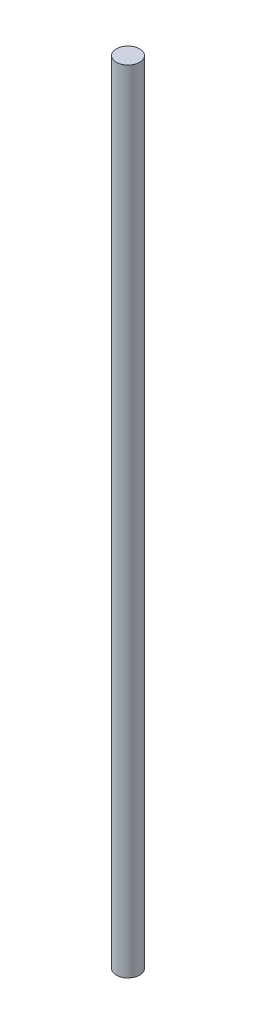
ISO-10303-21;
HEADER;
FILE_DESCRIPTION(('STEP AP214'),'2;1');
FILE_NAME('part.step','',(''),(''),'','','');
FILE_SCHEMA(('AUTOMOTIVE_DESIGN { 1 0 10303 214 1 1 1 1 }'));
ENDSEC;
DATA;
#1=APPLICATION_CONTEXT('core data for automotive mechanical design processes');
#2=APPLICATION_PROTOCOL_DEFINITION('international standard','automotive_design',2000,#1);
#3=PRODUCT_CONTEXT('',#1,'mechanical');
#4=PRODUCT('Part','Part','',(#3));
#5=PRODUCT_RELATED_PRODUCT_CATEGORY('part','',(#4));
#6=PRODUCT_DEFINITION_FORMATION('','',#4);
#7=PRODUCT_DEFINITION_CONTEXT('part definition',#1,'design');
#8=PRODUCT_DEFINITION('design','',#6,#7);
#9=PRODUCT_DEFINITION_SHAPE('','',#8);
#10=(LENGTH_UNIT() NAMED_UNIT(*) SI_UNIT(.MILLI.,.METRE.));
#11=(NAMED_UNIT(*) PLANE_ANGLE_UNIT() SI_UNIT($,.RADIAN.));
#12=(NAMED_UNIT(*) SI_UNIT($,.STERADIAN.) SOLID_ANGLE_UNIT());
#13=UNCERTAINTY_MEASURE_WITH_UNIT(LENGTH_MEASURE(1.E-05),#10,'distance_accuracy_value','');
#14=(GEOMETRIC_REPRESENTATION_CONTEXT(3) GLOBAL_UNCERTAINTY_ASSIGNED_CONTEXT((#13)) GLOBAL_UNIT_ASSIGNED_CONTEXT((#10,
#11,#12)) REPRESENTATION_CONTEXT('',''));
#15=CARTESIAN_POINT('',(0.,0.,0.));
#16=DIRECTION('',(0.,0.,1.));
#17=DIRECTION('',(1.,0.,0.));
#18=AXIS2_PLACEMENT_3D('',#15,#16,#17);
#19=CARTESIAN_POINT('',(0.,0.,0.));
#20=DIRECTION('',(0.,1.,0.));
#21=DIRECTION('',(0.,0.,1.));
#22=AXIS2_PLACEMENT_3D('',#19,#20,#21);
#23=PLANE('',#22);
#24=CARTESIAN_POINT('',(0.,0.,0.));
#25=DIRECTION('',(0.,-1.,0.));
#26=DIRECTION('',(0.,0.,-1.));
#27=AXIS2_PLACEMENT_3D('',#24,#25,#26);
#28=CIRCLE('',#27,1.3);
#29=CARTESIAN_POINT('',(0.,0.,-1.3));
#30=VERTEX_POINT('',#29);
#31=EDGE_CURVE('E10',#30,#30,#28,.T.);
#32=ORIENTED_EDGE('',*,*,#31,.F.);
#33=EDGE_LOOP('',(#32));
#34=FACE_BOUND('',#33,.T.);
#35=ADVANCED_FACE('F31',(#34),#23,.T.);
#36=CARTESIAN_POINT('',(0.,-92.,0.));
#37=DIRECTION('',(0.,-1.,0.));
#38=DIRECTION('',(0.,0.,-1.));
#39=AXIS2_PLACEMENT_3D('',#36,#37,#38);
#40=CYLINDRICAL_SURFACE('',#39,1.3);
#41=ORIENTED_EDGE('',*,*,#31,.T.);
#42=EDGE_LOOP('',(#41));
#43=FACE_BOUND('',#42,.T.);
#44=CARTESIAN_POINT('',(0.,-88.,0.));
#45=DIRECTION('',(0.,-1.,0.));
#46=DIRECTION('',(0.,0.,-1.));
#47=AXIS2_PLACEMENT_3D('',#44,#45,#46);
#48=CIRCLE('',#47,1.3);
#49=CARTESIAN_POINT('',(0.,-88.,-1.3));
#50=VERTEX_POINT('',#49);
#51=EDGE_CURVE('E37',#50,#50,#48,.T.);
#52=ORIENTED_EDGE('',*,*,#51,.F.);
#53=EDGE_LOOP('',(#52));
#54=FACE_BOUND('',#53,.T.);
#55=ADVANCED_FACE('F45',(#43,#54),#40,.T.);
#56=CARTESIAN_POINT('',(1.3,-88.,0.));
#57=DIRECTION('',(0.,-1.,0.));
#58=DIRECTION('',(0.,0.,-1.));
#59=AXIS2_PLACEMENT_3D('',#56,#57,#58);
#60=PLANE('',#59);
#61=ORIENTED_EDGE('',*,*,#51,.T.);
#62=EDGE_LOOP('',(#61));
#63=FACE_BOUND('',#62,.T.);
#64=ADVANCED_FACE('F43',(#63),#60,.T.);
#65=CLOSED_SHELL('',(#35,#55,#64));
#66=MANIFOLD_SOLID_BREP('B2',#65);
#67=ADVANCED_BREP_SHAPE_REPRESENTATION('',(#18,#66),#14);
#68=SHAPE_DEFINITION_REPRESENTATION(#9,#67);
ENDSEC;
END-ISO-10303-21;
